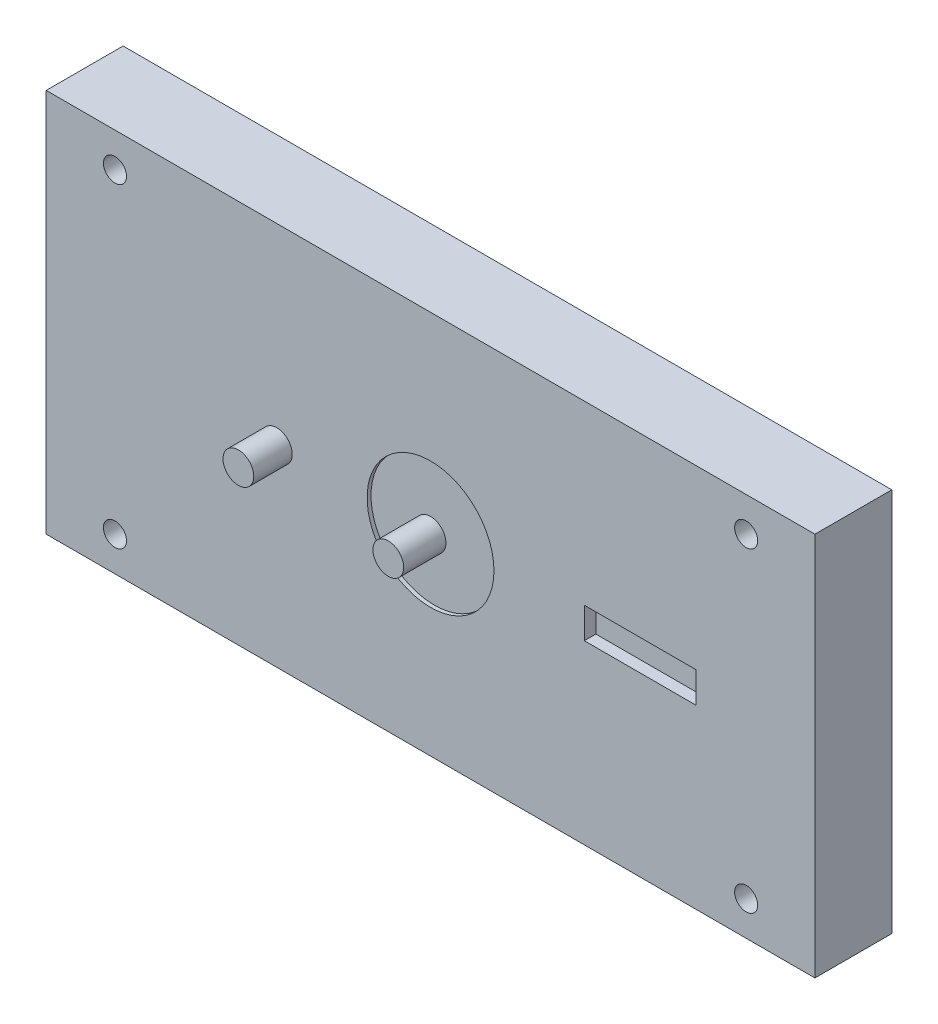
ISO-10303-21;
HEADER;
FILE_DESCRIPTION(('STEP AP214'),'2;1');
FILE_NAME('part.step','',(''),(''),'','','');
FILE_SCHEMA(('AUTOMOTIVE_DESIGN { 1 0 10303 214 1 1 1 1 }'));
ENDSEC;
DATA;
#1=APPLICATION_CONTEXT('core data for automotive mechanical design processes');
#2=APPLICATION_PROTOCOL_DEFINITION('international standard','automotive_design',2000,#1);
#3=PRODUCT_CONTEXT('',#1,'mechanical');
#4=PRODUCT('Part','Part','',(#3));
#5=PRODUCT_RELATED_PRODUCT_CATEGORY('part','',(#4));
#6=PRODUCT_DEFINITION_FORMATION('','',#4);
#7=PRODUCT_DEFINITION_CONTEXT('part definition',#1,'design');
#8=PRODUCT_DEFINITION('design','',#6,#7);
#9=PRODUCT_DEFINITION_SHAPE('','',#8);
#10=(LENGTH_UNIT() NAMED_UNIT(*) SI_UNIT(.MILLI.,.METRE.));
#11=(NAMED_UNIT(*) PLANE_ANGLE_UNIT() SI_UNIT($,.RADIAN.));
#12=(NAMED_UNIT(*) SI_UNIT($,.STERADIAN.) SOLID_ANGLE_UNIT());
#13=UNCERTAINTY_MEASURE_WITH_UNIT(LENGTH_MEASURE(1.E-05),#10,'distance_accuracy_value','');
#14=(GEOMETRIC_REPRESENTATION_CONTEXT(3) GLOBAL_UNCERTAINTY_ASSIGNED_CONTEXT((#13)) GLOBAL_UNIT_ASSIGNED_CONTEXT((#10,
#11,#12)) REPRESENTATION_CONTEXT('',''));
#15=CARTESIAN_POINT('',(0.,0.,0.));
#16=DIRECTION('',(0.,0.,1.));
#17=DIRECTION('',(1.,0.,0.));
#18=AXIS2_PLACEMENT_3D('',#15,#16,#17);
#19=CARTESIAN_POINT('',(100.,50.,11.));
#20=DIRECTION('',(0.,0.,-1.));
#21=DIRECTION('',(-1.,0.,0.));
#22=AXIS2_PLACEMENT_3D('',#19,#20,#21);
#23=CYLINDRICAL_SURFACE('',#22,4.00000000000001);
#24=CARTESIAN_POINT('',(100.,50.,11.));
#25=DIRECTION('',(0.,0.,1.));
#26=DIRECTION('',(1.,0.,0.));
#27=AXIS2_PLACEMENT_3D('',#24,#25,#26);
#28=CIRCLE('',#27,4.00000000000001);
#29=CARTESIAN_POINT('',(104.,50.,11.));
#30=VERTEX_POINT('',#29);
#31=EDGE_CURVE('E11',#30,#30,#28,.T.);
#32=ORIENTED_EDGE('',*,*,#31,.F.);
#33=EDGE_LOOP('',(#32));
#34=FACE_BOUND('',#33,.T.);
#35=CARTESIAN_POINT('',(100.,50.,0.));
#36=DIRECTION('',(0.,0.,1.));
#37=DIRECTION('',(1.,0.,0.));
#38=AXIS2_PLACEMENT_3D('',#35,#36,#37);
#39=CIRCLE('',#38,4.00000000000001);
#40=CARTESIAN_POINT('',(104.,50.,0.));
#41=VERTEX_POINT('',#40);
#42=EDGE_CURVE('E46',#41,#41,#39,.T.);
#43=ORIENTED_EDGE('',*,*,#42,.T.);
#44=EDGE_LOOP('',(#43));
#45=FACE_BOUND('',#44,.T.);
#46=ADVANCED_FACE('F43',(#34,#45),#23,.T.);
#47=CARTESIAN_POINT('',(100.,50.,11.));
#48=DIRECTION('',(0.,0.,1.));
#49=DIRECTION('',(1.,0.,0.));
#50=AXIS2_PLACEMENT_3D('',#47,#48,#49);
#51=PLANE('',#50);
#52=ORIENTED_EDGE('',*,*,#31,.T.);
#53=EDGE_LOOP('',(#52));
#54=FACE_BOUND('',#53,.T.);
#55=ADVANCED_FACE('F58',(#54),#51,.T.);
#56=CARTESIAN_POINT('',(100.,50.,0.));
#57=DIRECTION('',(0.,0.,1.));
#58=DIRECTION('',(1.,0.,0.));
#59=AXIS2_PLACEMENT_3D('',#56,#57,#58);
#60=PLANE('',#59);
#61=ORIENTED_EDGE('',*,*,#42,.F.);
#62=EDGE_LOOP('',(#61));
#63=FACE_BOUND('',#62,.T.);
#64=ADVANCED_FACE('F56',(#63),#60,.F.);
#65=CLOSED_SHELL('',(#46,#55,#64));
#66=MANIFOLD_SOLID_BREP('B2',#65);
#67=CARTESIAN_POINT('',(0.,0.,-20.));
#68=DIRECTION('',(0.,-1.,0.));
#69=DIRECTION('',(0.,0.,-1.));
#70=AXIS2_PLACEMENT_3D('',#67,#68,#69);
#71=PLANE('',#70);
#72=DIRECTION('',(1.,0.,0.));
#73=VECTOR('',#72,1.);
#74=CARTESIAN_POINT('',(0.,0.,0.));
#75=LINE('',#74,#73);
#76=CARTESIAN_POINT('',(0.,0.,0.));
#77=VERTEX_POINT('',#76);
#78=CARTESIAN_POINT('',(200.,0.,0.));
#79=VERTEX_POINT('',#78);
#80=EDGE_CURVE('E200',#77,#79,#75,.T.);
#81=ORIENTED_EDGE('',*,*,#80,.F.);
#82=DIRECTION('',(0.,0.,1.));
#83=VECTOR('',#82,1.);
#84=CARTESIAN_POINT('',(0.,0.,-20.));
#85=LINE('',#84,#83);
#86=CARTESIAN_POINT('',(0.,0.,-20.));
#87=VERTEX_POINT('',#86);
#88=EDGE_CURVE('E41',#87,#77,#85,.T.);
#89=ORIENTED_EDGE('',*,*,#88,.F.);
#90=DIRECTION('',(1.,0.,0.));
#91=VECTOR('',#90,1.);
#92=CARTESIAN_POINT('',(0.,0.,-20.));
#93=LINE('',#92,#91);
#94=CARTESIAN_POINT('',(200.,0.,-20.));
#95=VERTEX_POINT('',#94);
#96=EDGE_CURVE('E203',#87,#95,#93,.T.);
#97=ORIENTED_EDGE('',*,*,#96,.T.);
#98=DIRECTION('',(0.,0.,1.));
#99=VECTOR('',#98,1.);
#100=CARTESIAN_POINT('',(200.,0.,-20.));
#101=LINE('',#100,#99);
#102=EDGE_CURVE('E87',#95,#79,#101,.T.);
#103=ORIENTED_EDGE('',*,*,#102,.T.);
#104=EDGE_LOOP('',(#81,#89,#97,#103));
#105=FACE_BOUND('',#104,.T.);
#106=ADVANCED_FACE('F84',(#105),#71,.T.);
#107=CARTESIAN_POINT('',(0.,0.,-20.));
#108=DIRECTION('',(1.,0.,0.));
#109=DIRECTION('',(0.,0.,-1.));
#110=AXIS2_PLACEMENT_3D('',#107,#108,#109);
#111=PLANE('',#110);
#112=DIRECTION('',(0.,1.,0.));
#113=VECTOR('',#112,1.);
#114=CARTESIAN_POINT('',(0.,0.,0.));
#115=LINE('',#114,#113);
#116=CARTESIAN_POINT('',(0.,100.,0.));
#117=VERTEX_POINT('',#116);
#118=EDGE_CURVE('E206',#77,#117,#115,.T.);
#119=ORIENTED_EDGE('',*,*,#118,.T.);
#120=DIRECTION('',(0.,0.,1.));
#121=VECTOR('',#120,1.);
#122=CARTESIAN_POINT('',(0.,100.,-20.));
#123=LINE('',#122,#121);
#124=CARTESIAN_POINT('',(0.,100.,-20.));
#125=VERTEX_POINT('',#124);
#126=EDGE_CURVE('E92',#125,#117,#123,.T.);
#127=ORIENTED_EDGE('',*,*,#126,.F.);
#128=DIRECTION('',(0.,1.,0.));
#129=VECTOR('',#128,1.);
#130=CARTESIAN_POINT('',(0.,0.,-20.));
#131=LINE('',#130,#129);
#132=EDGE_CURVE('E210',#87,#125,#131,.T.);
#133=ORIENTED_EDGE('',*,*,#132,.F.);
#134=ORIENTED_EDGE('',*,*,#88,.T.);
#135=EDGE_LOOP('',(#119,#127,#133,#134));
#136=FACE_BOUND('',#135,.T.);
#137=ADVANCED_FACE('F230',(#136),#111,.F.);
#138=CARTESIAN_POINT('',(0.,100.,-20.));
#139=DIRECTION('',(0.,-1.,0.));
#140=DIRECTION('',(0.,0.,-1.));
#141=AXIS2_PLACEMENT_3D('',#138,#139,#140);
#142=PLANE('',#141);
#143=DIRECTION('',(1.,0.,0.));
#144=VECTOR('',#143,1.);
#145=CARTESIAN_POINT('',(0.,100.,0.));
#146=LINE('',#145,#144);
#147=CARTESIAN_POINT('',(200.,100.,0.));
#148=VERTEX_POINT('',#147);
#149=EDGE_CURVE('E217',#117,#148,#146,.T.);
#150=ORIENTED_EDGE('',*,*,#149,.T.);
#151=DIRECTION('',(0.,0.,1.));
#152=VECTOR('',#151,1.);
#153=CARTESIAN_POINT('',(200.,100.,-20.));
#154=LINE('',#153,#152);
#155=CARTESIAN_POINT('',(200.,100.,-20.));
#156=VERTEX_POINT('',#155);
#157=EDGE_CURVE('E222',#156,#148,#154,.T.);
#158=ORIENTED_EDGE('',*,*,#157,.F.);
#159=DIRECTION('',(1.,0.,0.));
#160=VECTOR('',#159,1.);
#161=CARTESIAN_POINT('',(0.,100.,-20.));
#162=LINE('',#161,#160);
#163=EDGE_CURVE('E208',#125,#156,#162,.T.);
#164=ORIENTED_EDGE('',*,*,#163,.F.);
#165=ORIENTED_EDGE('',*,*,#126,.T.);
#166=EDGE_LOOP('',(#150,#158,#164,#165));
#167=FACE_BOUND('',#166,.T.);
#168=ADVANCED_FACE('F233',(#167),#142,.F.);
#169=CARTESIAN_POINT('',(200.,0.,-20.));
#170=DIRECTION('',(1.,0.,0.));
#171=DIRECTION('',(0.,0.,-1.));
#172=AXIS2_PLACEMENT_3D('',#169,#170,#171);
#173=PLANE('',#172);
#174=DIRECTION('',(0.,1.,0.));
#175=VECTOR('',#174,1.);
#176=CARTESIAN_POINT('',(200.,0.,0.));
#177=LINE('',#176,#175);
#178=EDGE_CURVE('E214',#79,#148,#177,.T.);
#179=ORIENTED_EDGE('',*,*,#178,.F.);
#180=ORIENTED_EDGE('',*,*,#102,.F.);
#181=DIRECTION('',(0.,1.,0.));
#182=VECTOR('',#181,1.);
#183=CARTESIAN_POINT('',(200.,0.,-20.));
#184=LINE('',#183,#182);
#185=EDGE_CURVE('E205',#95,#156,#184,.T.);
#186=ORIENTED_EDGE('',*,*,#185,.T.);
#187=ORIENTED_EDGE('',*,*,#157,.T.);
#188=EDGE_LOOP('',(#179,#180,#186,#187));
#189=FACE_BOUND('',#188,.T.);
#190=ADVANCED_FACE('F225',(#189),#173,.T.);
#191=CARTESIAN_POINT('',(0.,0.,-20.));
#192=DIRECTION('',(0.,0.,1.));
#193=DIRECTION('',(1.,0.,0.));
#194=AXIS2_PLACEMENT_3D('',#191,#192,#193);
#195=PLANE('',#194);
#196=CARTESIAN_POINT('',(17.8885438199983,8.94427190999916,-20.));
#197=DIRECTION('',(0.,0.,1.));
#198=DIRECTION('',(1.,0.,0.));
#199=AXIS2_PLACEMENT_3D('',#196,#197,#198);
#200=CIRCLE('',#199,3.);
#201=CARTESIAN_POINT('',(20.8885438199983,8.94427190999916,-20.));
#202=VERTEX_POINT('',#201);
#203=EDGE_CURVE('E404',#202,#202,#200,.T.);
#204=ORIENTED_EDGE('',*,*,#203,.T.);
#205=EDGE_LOOP('',(#204));
#206=FACE_BOUND('',#205,.T.);
#207=CARTESIAN_POINT('',(182.111456180002,8.94427190999916,-20.));
#208=DIRECTION('',(0.,0.,1.));
#209=DIRECTION('',(1.,0.,0.));
#210=AXIS2_PLACEMENT_3D('',#207,#208,#209);
#211=CIRCLE('',#210,2.99999999999999);
#212=CARTESIAN_POINT('',(185.111456180002,8.94427190999916,-20.));
#213=VERTEX_POINT('',#212);
#214=EDGE_CURVE('E415',#213,#213,#211,.T.);
#215=ORIENTED_EDGE('',*,*,#214,.T.);
#216=EDGE_LOOP('',(#215));
#217=FACE_BOUND('',#216,.T.);
#218=CARTESIAN_POINT('',(182.111456180002,91.0557280900008,-20.));
#219=DIRECTION('',(0.,0.,1.));
#220=DIRECTION('',(1.,0.,0.));
#221=AXIS2_PLACEMENT_3D('',#218,#219,#220);
#222=CIRCLE('',#221,2.99999999999999);
#223=CARTESIAN_POINT('',(185.111456180002,91.0557280900008,-20.));
#224=VERTEX_POINT('',#223);
#225=EDGE_CURVE('E418',#224,#224,#222,.T.);
#226=ORIENTED_EDGE('',*,*,#225,.T.);
#227=EDGE_LOOP('',(#226));
#228=FACE_BOUND('',#227,.T.);
#229=CARTESIAN_POINT('',(17.8885438199983,91.0557280900009,-20.));
#230=DIRECTION('',(0.,0.,1.));
#231=DIRECTION('',(1.,0.,0.));
#232=AXIS2_PLACEMENT_3D('',#229,#230,#231);
#233=CIRCLE('',#232,3.);
#234=CARTESIAN_POINT('',(20.8885438199983,91.0557280900009,-20.));
#235=VERTEX_POINT('',#234);
#236=EDGE_CURVE('E187',#235,#235,#233,.T.);
#237=ORIENTED_EDGE('',*,*,#236,.T.);
#238=EDGE_LOOP('',(#237));
#239=FACE_BOUND('',#238,.T.);
#240=ORIENTED_EDGE('',*,*,#96,.F.);
#241=ORIENTED_EDGE('',*,*,#132,.T.);
#242=ORIENTED_EDGE('',*,*,#163,.T.);
#243=ORIENTED_EDGE('',*,*,#185,.F.);
#244=EDGE_LOOP('',(#240,#241,#242,#243));
#245=FACE_BOUND('',#244,.T.);
#246=ADVANCED_FACE('F235',(#206,#217,#228,#239,#245),#195,.F.);
#247=CARTESIAN_POINT('',(0.,0.,0.));
#248=DIRECTION('',(0.,0.,1.));
#249=DIRECTION('',(1.,0.,0.));
#250=AXIS2_PLACEMENT_3D('',#247,#248,#249);
#251=PLANE('',#250);
#252=CARTESIAN_POINT('',(60.,50.,0.));
#253=DIRECTION('',(0.,0.,1.));
#254=DIRECTION('',(1.,0.,0.));
#255=AXIS2_PLACEMENT_3D('',#252,#253,#254);
#256=CIRCLE('',#255,4.);
#257=CARTESIAN_POINT('',(64.,50.,0.));
#258=VERTEX_POINT('',#257);
#259=EDGE_CURVE('E405',#258,#258,#256,.T.);
#260=ORIENTED_EDGE('',*,*,#259,.F.);
#261=EDGE_LOOP('',(#260));
#262=FACE_BOUND('',#261,.T.);
#263=CARTESIAN_POINT('',(17.8885438199983,8.94427190999916,0.));
#264=DIRECTION('',(0.,0.,1.));
#265=DIRECTION('',(1.,0.,0.));
#266=AXIS2_PLACEMENT_3D('',#263,#264,#265);
#267=CIRCLE('',#266,3.);
#268=CARTESIAN_POINT('',(20.8885438199983,8.94427190999916,0.));
#269=VERTEX_POINT('',#268);
#270=EDGE_CURVE('E407',#269,#269,#267,.T.);
#271=ORIENTED_EDGE('',*,*,#270,.F.);
#272=EDGE_LOOP('',(#271));
#273=FACE_BOUND('',#272,.T.);
#274=CARTESIAN_POINT('',(182.111456180002,8.94427190999916,0.));
#275=DIRECTION('',(0.,0.,1.));
#276=DIRECTION('',(1.,0.,0.));
#277=AXIS2_PLACEMENT_3D('',#274,#275,#276);
#278=CIRCLE('',#277,2.99999999999999);
#279=CARTESIAN_POINT('',(185.111456180002,8.94427190999916,0.));
#280=VERTEX_POINT('',#279);
#281=EDGE_CURVE('E413',#280,#280,#278,.T.);
#282=ORIENTED_EDGE('',*,*,#281,.F.);
#283=EDGE_LOOP('',(#282));
#284=FACE_BOUND('',#283,.T.);
#285=CARTESIAN_POINT('',(182.111456180002,91.0557280900008,0.));
#286=DIRECTION('',(0.,0.,1.));
#287=DIRECTION('',(1.,0.,0.));
#288=AXIS2_PLACEMENT_3D('',#285,#286,#287);
#289=CIRCLE('',#288,2.99999999999999);
#290=CARTESIAN_POINT('',(185.111456180002,91.0557280900008,0.));
#291=VERTEX_POINT('',#290);
#292=EDGE_CURVE('E421',#291,#291,#289,.T.);
#293=ORIENTED_EDGE('',*,*,#292,.F.);
#294=EDGE_LOOP('',(#293));
#295=FACE_BOUND('',#294,.T.);
#296=CARTESIAN_POINT('',(17.8885438199983,91.0557280900009,0.));
#297=DIRECTION('',(0.,0.,1.));
#298=DIRECTION('',(1.,0.,0.));
#299=AXIS2_PLACEMENT_3D('',#296,#297,#298);
#300=CIRCLE('',#299,3.);
#301=CARTESIAN_POINT('',(20.8885438199983,91.0557280900009,0.));
#302=VERTEX_POINT('',#301);
#303=EDGE_CURVE('E180',#302,#302,#300,.T.);
#304=ORIENTED_EDGE('',*,*,#303,.F.);
#305=EDGE_LOOP('',(#304));
#306=FACE_BOUND('',#305,.T.);
#307=DIRECTION('',(1.,0.,0.));
#308=VECTOR('',#307,1.);
#309=CARTESIAN_POINT('',(0.,46.,0.));
#310=LINE('',#309,#308);
#311=CARTESIAN_POINT('',(140.,46.,0.));
#312=VERTEX_POINT('',#311);
#313=CARTESIAN_POINT('',(169.,46.,0.));
#314=VERTEX_POINT('',#313);
#315=EDGE_CURVE('E100',#312,#314,#310,.T.);
#316=ORIENTED_EDGE('',*,*,#315,.F.);
#317=DIRECTION('',(0.,1.,0.));
#318=VECTOR('',#317,1.);
#319=CARTESIAN_POINT('',(140.,0.,0.));
#320=LINE('',#319,#318);
#321=CARTESIAN_POINT('',(140.,54.,0.));
#322=VERTEX_POINT('',#321);
#323=EDGE_CURVE('E174',#312,#322,#320,.T.);
#324=ORIENTED_EDGE('',*,*,#323,.T.);
#325=DIRECTION('',(1.,0.,0.));
#326=VECTOR('',#325,1.);
#327=CARTESIAN_POINT('',(0.,54.,0.));
#328=LINE('',#327,#326);
#329=CARTESIAN_POINT('',(169.,54.,0.));
#330=VERTEX_POINT('',#329);
#331=EDGE_CURVE('E177',#322,#330,#328,.T.);
#332=ORIENTED_EDGE('',*,*,#331,.T.);
#333=DIRECTION('',(0.,1.,0.));
#334=VECTOR('',#333,1.);
#335=CARTESIAN_POINT('',(169.,0.,0.));
#336=LINE('',#335,#334);
#337=EDGE_CURVE('E186',#314,#330,#336,.T.);
#338=ORIENTED_EDGE('',*,*,#337,.F.);
#339=EDGE_LOOP('',(#316,#324,#332,#338));
#340=FACE_BOUND('',#339,.T.);
#341=CARTESIAN_POINT('',(100.,50.,0.));
#342=DIRECTION('',(0.,0.,1.));
#343=DIRECTION('',(1.,0.,0.));
#344=AXIS2_PLACEMENT_3D('',#341,#342,#343);
#345=CIRCLE('',#344,16.5);
#346=CARTESIAN_POINT('',(116.5,50.,0.));
#347=VERTEX_POINT('',#346);
#348=EDGE_CURVE('E193',#347,#347,#345,.T.);
#349=ORIENTED_EDGE('',*,*,#348,.F.);
#350=EDGE_LOOP('',(#349));
#351=FACE_BOUND('',#350,.T.);
#352=ORIENTED_EDGE('',*,*,#80,.T.);
#353=ORIENTED_EDGE('',*,*,#178,.T.);
#354=ORIENTED_EDGE('',*,*,#149,.F.);
#355=ORIENTED_EDGE('',*,*,#118,.F.);
#356=EDGE_LOOP('',(#352,#353,#354,#355));
#357=FACE_BOUND('',#356,.T.);
#358=ADVANCED_FACE('F228',(#262,#273,#284,#295,#306,#340,#351,#357),#251,.T.);
#359=CARTESIAN_POINT('',(100.,50.,-1.));
#360=DIRECTION('',(0.,0.,1.));
#361=DIRECTION('',(1.,0.,0.));
#362=AXIS2_PLACEMENT_3D('',#359,#360,#361);
#363=CYLINDRICAL_SURFACE('',#362,16.5);
#364=CARTESIAN_POINT('',(100.,50.,-1.));
#365=DIRECTION('',(0.,0.,1.));
#366=DIRECTION('',(1.,0.,0.));
#367=AXIS2_PLACEMENT_3D('',#364,#365,#366);
#368=CIRCLE('',#367,16.5);
#369=CARTESIAN_POINT('',(116.5,50.,-1.));
#370=VERTEX_POINT('',#369);
#371=EDGE_CURVE('E197',#370,#370,#368,.T.);
#372=ORIENTED_EDGE('',*,*,#371,.F.);
#373=EDGE_LOOP('',(#372));
#374=FACE_BOUND('',#373,.T.);
#375=ORIENTED_EDGE('',*,*,#348,.T.);
#376=EDGE_LOOP('',(#375));
#377=FACE_BOUND('',#376,.T.);
#378=ADVANCED_FACE('F243',(#374,#377),#363,.F.);
#379=CARTESIAN_POINT('',(100.,50.,-1.));
#380=DIRECTION('',(0.,0.,1.));
#381=DIRECTION('',(1.,0.,0.));
#382=AXIS2_PLACEMENT_3D('',#379,#380,#381);
#383=PLANE('',#382);
#384=ORIENTED_EDGE('',*,*,#371,.T.);
#385=EDGE_LOOP('',(#384));
#386=FACE_BOUND('',#385,.T.);
#387=ADVANCED_FACE('F274',(#386),#383,.T.);
#388=CARTESIAN_POINT('',(0.,46.,-3.));
#389=DIRECTION('',(0.,-1.,0.));
#390=DIRECTION('',(0.,0.,-1.));
#391=AXIS2_PLACEMENT_3D('',#388,#389,#390);
#392=PLANE('',#391);
#393=ORIENTED_EDGE('',*,*,#315,.T.);
#394=DIRECTION('',(0.,0.,1.));
#395=VECTOR('',#394,1.);
#396=CARTESIAN_POINT('',(169.,46.,-3.));
#397=LINE('',#396,#395);
#398=CARTESIAN_POINT('',(169.,46.,-3.));
#399=VERTEX_POINT('',#398);
#400=EDGE_CURVE('E153',#399,#314,#397,.T.);
#401=ORIENTED_EDGE('',*,*,#400,.F.);
#402=DIRECTION('',(1.,0.,0.));
#403=VECTOR('',#402,1.);
#404=CARTESIAN_POINT('',(0.,46.,-3.));
#405=LINE('',#404,#403);
#406=CARTESIAN_POINT('',(140.,46.,-3.));
#407=VERTEX_POINT('',#406);
#408=EDGE_CURVE('E157',#407,#399,#405,.T.);
#409=ORIENTED_EDGE('',*,*,#408,.F.);
#410=DIRECTION('',(0.,0.,1.));
#411=VECTOR('',#410,1.);
#412=CARTESIAN_POINT('',(140.,46.,-3.));
#413=LINE('',#412,#411);
#414=EDGE_CURVE('E191',#407,#312,#413,.T.);
#415=ORIENTED_EDGE('',*,*,#414,.T.);
#416=EDGE_LOOP('',(#393,#401,#409,#415));
#417=FACE_BOUND('',#416,.T.);
#418=ADVANCED_FACE('F155',(#417),#392,.F.);
#419=CARTESIAN_POINT('',(140.,0.,-3.));
#420=DIRECTION('',(1.,0.,0.));
#421=DIRECTION('',(0.,0.,-1.));
#422=AXIS2_PLACEMENT_3D('',#419,#420,#421);
#423=PLANE('',#422);
#424=ORIENTED_EDGE('',*,*,#323,.F.);
#425=ORIENTED_EDGE('',*,*,#414,.F.);
#426=DIRECTION('',(0.,1.,0.));
#427=VECTOR('',#426,1.);
#428=CARTESIAN_POINT('',(140.,0.,-3.));
#429=LINE('',#428,#427);
#430=CARTESIAN_POINT('',(140.,54.,-3.));
#431=VERTEX_POINT('',#430);
#432=EDGE_CURVE('E162',#407,#431,#429,.T.);
#433=ORIENTED_EDGE('',*,*,#432,.T.);
#434=DIRECTION('',(0.,0.,1.));
#435=VECTOR('',#434,1.);
#436=CARTESIAN_POINT('',(140.,54.,-3.));
#437=LINE('',#436,#435);
#438=EDGE_CURVE('E194',#431,#322,#437,.T.);
#439=ORIENTED_EDGE('',*,*,#438,.T.);
#440=EDGE_LOOP('',(#424,#425,#433,#439));
#441=FACE_BOUND('',#440,.T.);
#442=ADVANCED_FACE('F293',(#441),#423,.T.);
#443=CARTESIAN_POINT('',(0.,54.,-3.));
#444=DIRECTION('',(0.,-1.,0.));
#445=DIRECTION('',(0.,0.,-1.));
#446=AXIS2_PLACEMENT_3D('',#443,#444,#445);
#447=PLANE('',#446);
#448=ORIENTED_EDGE('',*,*,#331,.F.);
#449=ORIENTED_EDGE('',*,*,#438,.F.);
#450=DIRECTION('',(1.,0.,0.));
#451=VECTOR('',#450,1.);
#452=CARTESIAN_POINT('',(0.,54.,-3.));
#453=LINE('',#452,#451);
#454=CARTESIAN_POINT('',(169.,54.,-3.));
#455=VERTEX_POINT('',#454);
#456=EDGE_CURVE('E170',#431,#455,#453,.T.);
#457=ORIENTED_EDGE('',*,*,#456,.T.);
#458=DIRECTION('',(0.,0.,1.));
#459=VECTOR('',#458,1.);
#460=CARTESIAN_POINT('',(169.,54.,-3.));
#461=LINE('',#460,#459);
#462=EDGE_CURVE('E161',#455,#330,#461,.T.);
#463=ORIENTED_EDGE('',*,*,#462,.T.);
#464=EDGE_LOOP('',(#448,#449,#457,#463));
#465=FACE_BOUND('',#464,.T.);
#466=ADVANCED_FACE('F303',(#465),#447,.T.);
#467=CARTESIAN_POINT('',(169.,0.,-3.));
#468=DIRECTION('',(1.,0.,0.));
#469=DIRECTION('',(0.,0.,-1.));
#470=AXIS2_PLACEMENT_3D('',#467,#468,#469);
#471=PLANE('',#470);
#472=ORIENTED_EDGE('',*,*,#337,.T.);
#473=ORIENTED_EDGE('',*,*,#462,.F.);
#474=DIRECTION('',(0.,1.,0.));
#475=VECTOR('',#474,1.);
#476=CARTESIAN_POINT('',(169.,0.,-3.));
#477=LINE('',#476,#475);
#478=EDGE_CURVE('E166',#399,#455,#477,.T.);
#479=ORIENTED_EDGE('',*,*,#478,.F.);
#480=ORIENTED_EDGE('',*,*,#400,.T.);
#481=EDGE_LOOP('',(#472,#473,#479,#480));
#482=FACE_BOUND('',#481,.T.);
#483=ADVANCED_FACE('F167',(#482),#471,.F.);
#484=CARTESIAN_POINT('',(0.,0.,-3.));
#485=DIRECTION('',(0.,0.,1.));
#486=DIRECTION('',(1.,0.,0.));
#487=AXIS2_PLACEMENT_3D('',#484,#485,#486);
#488=PLANE('',#487);
#489=ORIENTED_EDGE('',*,*,#408,.T.);
#490=ORIENTED_EDGE('',*,*,#478,.T.);
#491=ORIENTED_EDGE('',*,*,#456,.F.);
#492=ORIENTED_EDGE('',*,*,#432,.F.);
#493=EDGE_LOOP('',(#489,#490,#491,#492));
#494=FACE_BOUND('',#493,.T.);
#495=ADVANCED_FACE('F173',(#494),#488,.T.);
#496=CARTESIAN_POINT('',(17.8885438199983,91.0557280900009,-20.));
#497=DIRECTION('',(0.,0.,1.));
#498=DIRECTION('',(1.,0.,0.));
#499=AXIS2_PLACEMENT_3D('',#496,#497,#498);
#500=CYLINDRICAL_SURFACE('',#499,3.);
#501=ORIENTED_EDGE('',*,*,#236,.F.);
#502=EDGE_LOOP('',(#501));
#503=FACE_BOUND('',#502,.T.);
#504=ORIENTED_EDGE('',*,*,#303,.T.);
#505=EDGE_LOOP('',(#504));
#506=FACE_BOUND('',#505,.T.);
#507=ADVANCED_FACE('F330',(#503,#506),#500,.F.);
#508=CARTESIAN_POINT('',(182.111456180002,91.0557280900008,-20.));
#509=DIRECTION('',(0.,0.,1.));
#510=DIRECTION('',(1.,0.,0.));
#511=AXIS2_PLACEMENT_3D('',#508,#509,#510);
#512=CYLINDRICAL_SURFACE('',#511,2.99999999999999);
#513=ORIENTED_EDGE('',*,*,#225,.F.);
#514=EDGE_LOOP('',(#513));
#515=FACE_BOUND('',#514,.T.);
#516=ORIENTED_EDGE('',*,*,#292,.T.);
#517=EDGE_LOOP('',(#516));
#518=FACE_BOUND('',#517,.T.);
#519=ADVANCED_FACE('F339',(#515,#518),#512,.F.);
#520=CARTESIAN_POINT('',(182.111456180002,8.94427190999916,-20.));
#521=DIRECTION('',(0.,0.,1.));
#522=DIRECTION('',(1.,0.,0.));
#523=AXIS2_PLACEMENT_3D('',#520,#521,#522);
#524=CYLINDRICAL_SURFACE('',#523,2.99999999999999);
#525=ORIENTED_EDGE('',*,*,#214,.F.);
#526=EDGE_LOOP('',(#525));
#527=FACE_BOUND('',#526,.T.);
#528=ORIENTED_EDGE('',*,*,#281,.T.);
#529=EDGE_LOOP('',(#528));
#530=FACE_BOUND('',#529,.T.);
#531=ADVANCED_FACE('F348',(#527,#530),#524,.F.);
#532=CARTESIAN_POINT('',(17.8885438199983,8.94427190999916,-20.));
#533=DIRECTION('',(0.,0.,1.));
#534=DIRECTION('',(1.,0.,0.));
#535=AXIS2_PLACEMENT_3D('',#532,#533,#534);
#536=CYLINDRICAL_SURFACE('',#535,3.);
#537=ORIENTED_EDGE('',*,*,#203,.F.);
#538=EDGE_LOOP('',(#537));
#539=FACE_BOUND('',#538,.T.);
#540=ORIENTED_EDGE('',*,*,#270,.T.);
#541=EDGE_LOOP('',(#540));
#542=FACE_BOUND('',#541,.T.);
#543=ADVANCED_FACE('F362',(#539,#542),#536,.F.);
#544=CARTESIAN_POINT('',(60.,50.,10.));
#545=DIRECTION('',(0.,0.,-1.));
#546=DIRECTION('',(-1.,0.,0.));
#547=AXIS2_PLACEMENT_3D('',#544,#545,#546);
#548=CYLINDRICAL_SURFACE('',#547,4.);
#549=CARTESIAN_POINT('',(60.,50.,10.));
#550=DIRECTION('',(0.,0.,1.));
#551=DIRECTION('',(1.,0.,0.));
#552=AXIS2_PLACEMENT_3D('',#549,#550,#551);
#553=CIRCLE('',#552,4.);
#554=CARTESIAN_POINT('',(64.,50.,10.));
#555=VERTEX_POINT('',#554);
#556=EDGE_CURVE('E403',#555,#555,#553,.T.);
#557=ORIENTED_EDGE('',*,*,#556,.F.);
#558=EDGE_LOOP('',(#557));
#559=FACE_BOUND('',#558,.T.);
#560=ORIENTED_EDGE('',*,*,#259,.T.);
#561=EDGE_LOOP('',(#560));
#562=FACE_BOUND('',#561,.T.);
#563=ADVANCED_FACE('F372',(#559,#562),#548,.T.);
#564=CARTESIAN_POINT('',(60.,50.,10.));
#565=DIRECTION('',(0.,0.,1.));
#566=DIRECTION('',(1.,0.,0.));
#567=AXIS2_PLACEMENT_3D('',#564,#565,#566);
#568=PLANE('',#567);
#569=ORIENTED_EDGE('',*,*,#556,.T.);
#570=EDGE_LOOP('',(#569));
#571=FACE_BOUND('',#570,.T.);
#572=ADVANCED_FACE('F387',(#571),#568,.T.);
#573=CLOSED_SHELL('',(#106,#137,#168,#190,#246,#358,#378,#387,#418,#442,#466,#483,#495,#507,
#519,#531,#543,#563,#572));
#574=MANIFOLD_SOLID_BREP('B6',#573);
#575=ADVANCED_BREP_SHAPE_REPRESENTATION('',(#18,#66,#574),#14);
#576=SHAPE_DEFINITION_REPRESENTATION(#9,#575);
ENDSEC;
END-ISO-10303-21;
